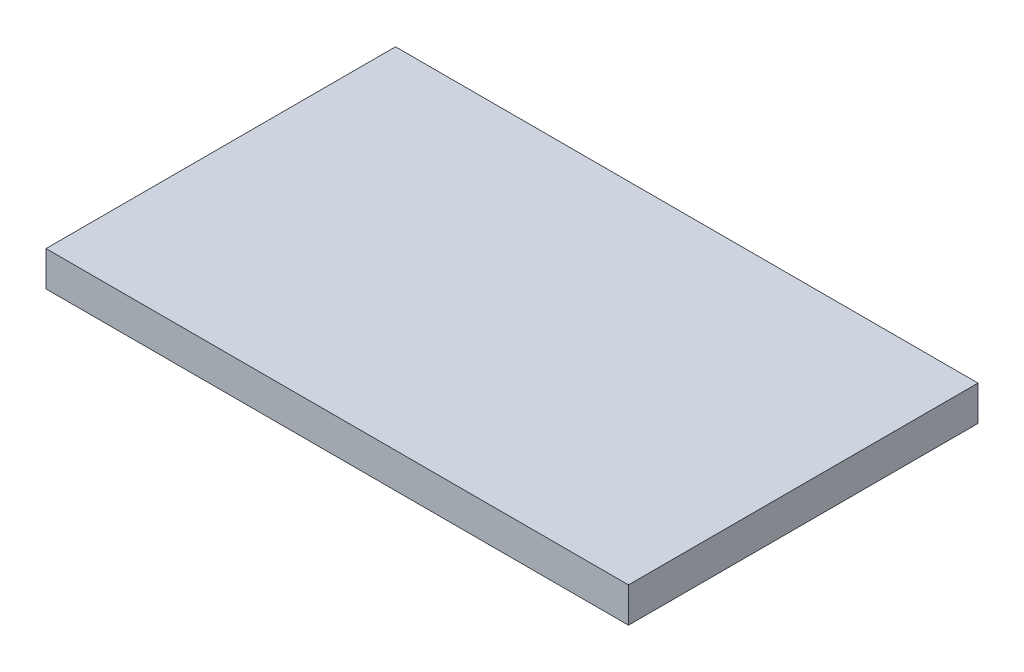
ISO-10303-21;
HEADER;
FILE_DESCRIPTION(('STEP AP214'),'2;1');
FILE_NAME('part.step','',(''),(''),'','','');
FILE_SCHEMA(('AUTOMOTIVE_DESIGN { 1 0 10303 214 1 1 1 1 }'));
ENDSEC;
DATA;
#1=APPLICATION_CONTEXT('core data for automotive mechanical design processes');
#2=APPLICATION_PROTOCOL_DEFINITION('international standard','automotive_design',2000,#1);
#3=PRODUCT_CONTEXT('',#1,'mechanical');
#4=PRODUCT('Part','Part','',(#3));
#5=PRODUCT_RELATED_PRODUCT_CATEGORY('part','',(#4));
#6=PRODUCT_DEFINITION_FORMATION('','',#4);
#7=PRODUCT_DEFINITION_CONTEXT('part definition',#1,'design');
#8=PRODUCT_DEFINITION('design','',#6,#7);
#9=PRODUCT_DEFINITION_SHAPE('','',#8);
#10=(LENGTH_UNIT() NAMED_UNIT(*) SI_UNIT(.MILLI.,.METRE.));
#11=(NAMED_UNIT(*) PLANE_ANGLE_UNIT() SI_UNIT($,.RADIAN.));
#12=(NAMED_UNIT(*) SI_UNIT($,.STERADIAN.) SOLID_ANGLE_UNIT());
#13=UNCERTAINTY_MEASURE_WITH_UNIT(LENGTH_MEASURE(1.E-05),#10,'distance_accuracy_value','');
#14=(GEOMETRIC_REPRESENTATION_CONTEXT(3) GLOBAL_UNCERTAINTY_ASSIGNED_CONTEXT((#13)) GLOBAL_UNIT_ASSIGNED_CONTEXT((#10,
#11,#12)) REPRESENTATION_CONTEXT('',''));
#15=CARTESIAN_POINT('',(0.,0.,0.));
#16=DIRECTION('',(0.,0.,1.));
#17=DIRECTION('',(1.,0.,0.));
#18=AXIS2_PLACEMENT_3D('',#15,#16,#17);
#19=CARTESIAN_POINT('',(250.,-30.,-150.));
#20=DIRECTION('',(1.,0.,0.));
#21=DIRECTION('',(0.,0.,-1.));
#22=AXIS2_PLACEMENT_3D('',#19,#20,#21);
#23=PLANE('',#22);
#24=DIRECTION('',(0.,0.,-1.));
#25=VECTOR('',#24,1.);
#26=CARTESIAN_POINT('',(250.,0.,-150.));
#27=LINE('',#26,#25);
#28=CARTESIAN_POINT('',(250.,0.,150.));
#29=VERTEX_POINT('',#28);
#30=CARTESIAN_POINT('',(250.,0.,-150.));
#31=VERTEX_POINT('',#30);
#32=EDGE_CURVE('E97',#29,#31,#27,.T.);
#33=ORIENTED_EDGE('',*,*,#32,.F.);
#34=DIRECTION('',(0.,1.,0.));
#35=VECTOR('',#34,1.);
#36=CARTESIAN_POINT('',(250.,-30.,150.));
#37=LINE('',#36,#35);
#38=CARTESIAN_POINT('',(250.,-30.,150.));
#39=VERTEX_POINT('',#38);
#40=EDGE_CURVE('E11',#39,#29,#37,.T.);
#41=ORIENTED_EDGE('',*,*,#40,.F.);
#42=DIRECTION('',(0.,0.,-1.));
#43=VECTOR('',#42,1.);
#44=CARTESIAN_POINT('',(250.,-30.,-150.));
#45=LINE('',#44,#43);
#46=CARTESIAN_POINT('',(250.,-30.,-150.));
#47=VERTEX_POINT('',#46);
#48=EDGE_CURVE('E91',#39,#47,#45,.T.);
#49=ORIENTED_EDGE('',*,*,#48,.T.);
#50=DIRECTION('',(0.,1.,0.));
#51=VECTOR('',#50,1.);
#52=CARTESIAN_POINT('',(250.,-30.,-150.));
#53=LINE('',#52,#51);
#54=EDGE_CURVE('E36',#47,#31,#53,.T.);
#55=ORIENTED_EDGE('',*,*,#54,.T.);
#56=EDGE_LOOP('',(#33,#41,#49,#55));
#57=FACE_BOUND('',#56,.T.);
#58=ADVANCED_FACE('F33',(#57),#23,.T.);
#59=CARTESIAN_POINT('',(-250.,-30.,150.));
#60=DIRECTION('',(0.,0.,1.));
#61=DIRECTION('',(1.,0.,0.));
#62=AXIS2_PLACEMENT_3D('',#59,#60,#61);
#63=PLANE('',#62);
#64=DIRECTION('',(1.,0.,0.));
#65=VECTOR('',#64,1.);
#66=CARTESIAN_POINT('',(-250.,0.,150.));
#67=LINE('',#66,#65);
#68=CARTESIAN_POINT('',(-250.,0.,150.));
#69=VERTEX_POINT('',#68);
#70=EDGE_CURVE('E93',#69,#29,#67,.T.);
#71=ORIENTED_EDGE('',*,*,#70,.F.);
#72=DIRECTION('',(0.,1.,0.));
#73=VECTOR('',#72,1.);
#74=CARTESIAN_POINT('',(-250.,-30.,150.));
#75=LINE('',#74,#73);
#76=CARTESIAN_POINT('',(-250.,-30.,150.));
#77=VERTEX_POINT('',#76);
#78=EDGE_CURVE('E42',#77,#69,#75,.T.);
#79=ORIENTED_EDGE('',*,*,#78,.F.);
#80=DIRECTION('',(1.,0.,0.));
#81=VECTOR('',#80,1.);
#82=CARTESIAN_POINT('',(-250.,-30.,150.));
#83=LINE('',#82,#81);
#84=EDGE_CURVE('E88',#77,#39,#83,.T.);
#85=ORIENTED_EDGE('',*,*,#84,.T.);
#86=ORIENTED_EDGE('',*,*,#40,.T.);
#87=EDGE_LOOP('',(#71,#79,#85,#86));
#88=FACE_BOUND('',#87,.T.);
#89=ADVANCED_FACE('F107',(#88),#63,.T.);
#90=CARTESIAN_POINT('',(-250.,-30.,-150.));
#91=DIRECTION('',(-1.,0.,0.));
#92=DIRECTION('',(0.,0.,1.));
#93=AXIS2_PLACEMENT_3D('',#90,#91,#92);
#94=PLANE('',#93);
#95=DIRECTION('',(0.,0.,1.));
#96=VECTOR('',#95,1.);
#97=CARTESIAN_POINT('',(-250.,0.,-150.));
#98=LINE('',#97,#96);
#99=CARTESIAN_POINT('',(-250.,0.,-150.));
#100=VERTEX_POINT('',#99);
#101=EDGE_CURVE('E83',#100,#69,#98,.T.);
#102=ORIENTED_EDGE('',*,*,#101,.F.);
#103=DIRECTION('',(0.,1.,0.));
#104=VECTOR('',#103,1.);
#105=CARTESIAN_POINT('',(-250.,-30.,-150.));
#106=LINE('',#105,#104);
#107=CARTESIAN_POINT('',(-250.,-30.,-150.));
#108=VERTEX_POINT('',#107);
#109=EDGE_CURVE('E78',#108,#100,#106,.T.);
#110=ORIENTED_EDGE('',*,*,#109,.F.);
#111=DIRECTION('',(0.,0.,1.));
#112=VECTOR('',#111,1.);
#113=CARTESIAN_POINT('',(-250.,-30.,-150.));
#114=LINE('',#113,#112);
#115=EDGE_CURVE('E81',#108,#77,#114,.T.);
#116=ORIENTED_EDGE('',*,*,#115,.T.);
#117=ORIENTED_EDGE('',*,*,#78,.T.);
#118=EDGE_LOOP('',(#102,#110,#116,#117));
#119=FACE_BOUND('',#118,.T.);
#120=ADVANCED_FACE('F80',(#119),#94,.T.);
#121=CARTESIAN_POINT('',(-250.,-30.,-150.));
#122=DIRECTION('',(0.,0.,-1.));
#123=DIRECTION('',(-1.,0.,0.));
#124=AXIS2_PLACEMENT_3D('',#121,#122,#123);
#125=PLANE('',#124);
#126=DIRECTION('',(-1.,0.,0.));
#127=VECTOR('',#126,1.);
#128=CARTESIAN_POINT('',(-250.,0.,-150.));
#129=LINE('',#128,#127);
#130=EDGE_CURVE('E100',#31,#100,#129,.T.);
#131=ORIENTED_EDGE('',*,*,#130,.F.);
#132=ORIENTED_EDGE('',*,*,#54,.F.);
#133=DIRECTION('',(-1.,0.,0.));
#134=VECTOR('',#133,1.);
#135=CARTESIAN_POINT('',(-250.,-30.,-150.));
#136=LINE('',#135,#134);
#137=EDGE_CURVE('E87',#47,#108,#136,.T.);
#138=ORIENTED_EDGE('',*,*,#137,.T.);
#139=ORIENTED_EDGE('',*,*,#109,.T.);
#140=EDGE_LOOP('',(#131,#132,#138,#139));
#141=FACE_BOUND('',#140,.T.);
#142=ADVANCED_FACE('F90',(#141),#125,.T.);
#143=CARTESIAN_POINT('',(0.,-30.,0.));
#144=DIRECTION('',(0.,1.,0.));
#145=DIRECTION('',(0.,0.,1.));
#146=AXIS2_PLACEMENT_3D('',#143,#144,#145);
#147=PLANE('',#146);
#148=ORIENTED_EDGE('',*,*,#48,.F.);
#149=ORIENTED_EDGE('',*,*,#84,.F.);
#150=ORIENTED_EDGE('',*,*,#115,.F.);
#151=ORIENTED_EDGE('',*,*,#137,.F.);
#152=EDGE_LOOP('',(#148,#149,#150,#151));
#153=FACE_BOUND('',#152,.T.);
#154=ADVANCED_FACE('F86',(#153),#147,.F.);
#155=CARTESIAN_POINT('',(0.,0.,0.));
#156=DIRECTION('',(0.,1.,0.));
#157=DIRECTION('',(0.,0.,1.));
#158=AXIS2_PLACEMENT_3D('',#155,#156,#157);
#159=PLANE('',#158);
#160=ORIENTED_EDGE('',*,*,#32,.T.);
#161=ORIENTED_EDGE('',*,*,#130,.T.);
#162=ORIENTED_EDGE('',*,*,#101,.T.);
#163=ORIENTED_EDGE('',*,*,#70,.T.);
#164=EDGE_LOOP('',(#160,#161,#162,#163));
#165=FACE_BOUND('',#164,.T.);
#166=ADVANCED_FACE('F106',(#165),#159,.T.);
#167=CLOSED_SHELL('',(#58,#89,#120,#142,#154,#166));
#168=MANIFOLD_SOLID_BREP('B2',#167);
#169=ADVANCED_BREP_SHAPE_REPRESENTATION('',(#18,#168),#14);
#170=SHAPE_DEFINITION_REPRESENTATION(#9,#169);
ENDSEC;
END-ISO-10303-21;
